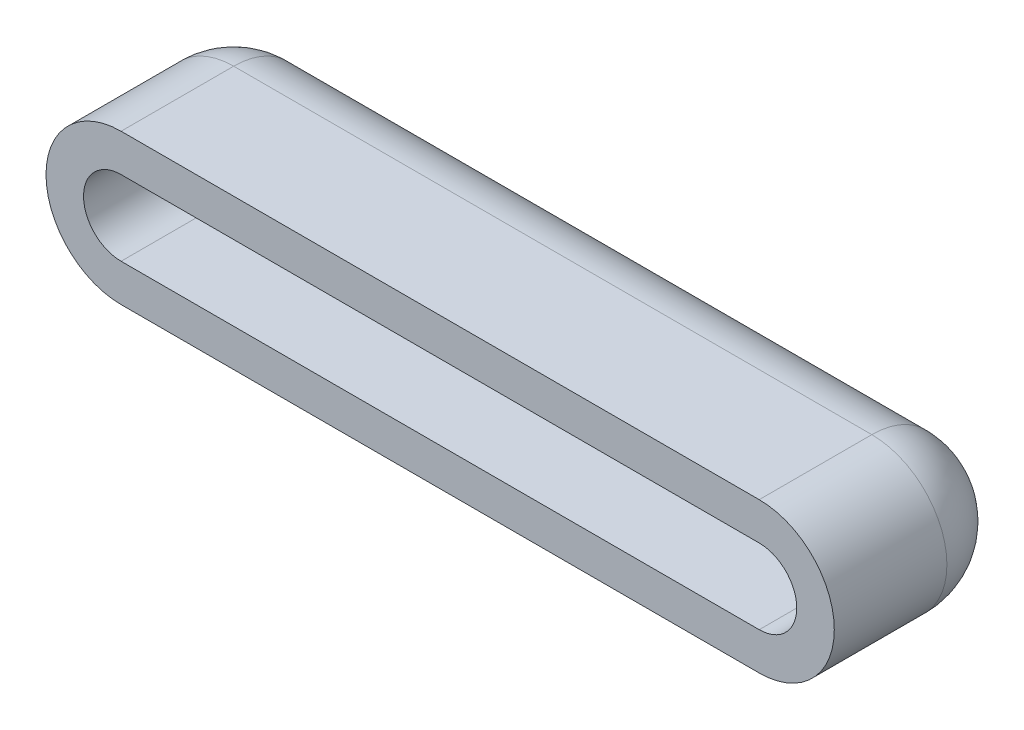
ISO-10303-21;
HEADER;
FILE_DESCRIPTION(('STEP AP214'),'2;1');
FILE_NAME('part.step','',(''),(''),'','','');
FILE_SCHEMA(('AUTOMOTIVE_DESIGN { 1 0 10303 214 1 1 1 1 }'));
ENDSEC;
DATA;
#1=APPLICATION_CONTEXT('core data for automotive mechanical design processes');
#2=APPLICATION_PROTOCOL_DEFINITION('international standard','automotive_design',2000,#1);
#3=PRODUCT_CONTEXT('',#1,'mechanical');
#4=PRODUCT('Part','Part','',(#3));
#5=PRODUCT_RELATED_PRODUCT_CATEGORY('part','',(#4));
#6=PRODUCT_DEFINITION_FORMATION('','',#4);
#7=PRODUCT_DEFINITION_CONTEXT('part definition',#1,'design');
#8=PRODUCT_DEFINITION('design','',#6,#7);
#9=PRODUCT_DEFINITION_SHAPE('','',#8);
#10=(LENGTH_UNIT() NAMED_UNIT(*) SI_UNIT(.MILLI.,.METRE.));
#11=(NAMED_UNIT(*) PLANE_ANGLE_UNIT() SI_UNIT($,.RADIAN.));
#12=(NAMED_UNIT(*) SI_UNIT($,.STERADIAN.) SOLID_ANGLE_UNIT());
#13=UNCERTAINTY_MEASURE_WITH_UNIT(LENGTH_MEASURE(1.E-05),#10,'distance_accuracy_value','');
#14=(GEOMETRIC_REPRESENTATION_CONTEXT(3) GLOBAL_UNCERTAINTY_ASSIGNED_CONTEXT((#13)) GLOBAL_UNIT_ASSIGNED_CONTEXT((#10,
#11,#12)) REPRESENTATION_CONTEXT('',''));
#15=CARTESIAN_POINT('',(0.,0.,0.));
#16=DIRECTION('',(0.,0.,1.));
#17=DIRECTION('',(1.,0.,0.));
#18=AXIS2_PLACEMENT_3D('',#15,#16,#17);
#19=CARTESIAN_POINT('',(0.,0.,10.));
#20=DIRECTION('',(0.,0.,-1.));
#21=DIRECTION('',(-1.,0.,0.));
#22=AXIS2_PLACEMENT_3D('',#19,#20,#21);
#23=CYLINDRICAL_SURFACE('',#22,4.);
#24=DIRECTION('',(0.,0.,-1.));
#25=VECTOR('',#24,1.);
#26=CARTESIAN_POINT('',(0.,4.,10.));
#27=LINE('',#26,#25);
#28=CARTESIAN_POINT('',(0.,4.,10.));
#29=VERTEX_POINT('',#28);
#30=CARTESIAN_POINT('',(0.,4.,4.));
#31=VERTEX_POINT('',#30);
#32=EDGE_CURVE('E104',#29,#31,#27,.T.);
#33=ORIENTED_EDGE('',*,*,#32,.T.);
#34=CARTESIAN_POINT('',(0.,0.,4.));
#35=DIRECTION('',(0.,0.,-1.));
#36=DIRECTION('',(-1.,0.,0.));
#37=AXIS2_PLACEMENT_3D('',#34,#35,#36);
#38=CIRCLE('',#37,4.);
#39=CARTESIAN_POINT('',(0.,-4.,4.));
#40=VERTEX_POINT('',#39);
#41=EDGE_CURVE('E11',#31,#40,#38,.F.);
#42=ORIENTED_EDGE('',*,*,#41,.T.);
#43=DIRECTION('',(0.,0.,-1.));
#44=VECTOR('',#43,1.);
#45=CARTESIAN_POINT('',(0.,-4.,10.));
#46=LINE('',#45,#44);
#47=CARTESIAN_POINT('',(0.,-4.,10.));
#48=VERTEX_POINT('',#47);
#49=EDGE_CURVE('E96',#48,#40,#46,.T.);
#50=ORIENTED_EDGE('',*,*,#49,.F.);
#51=CARTESIAN_POINT('',(0.,0.,10.));
#52=DIRECTION('',(0.,0.,1.));
#53=DIRECTION('',(1.,0.,0.));
#54=AXIS2_PLACEMENT_3D('',#51,#52,#53);
#55=CIRCLE('',#54,4.);
#56=EDGE_CURVE('E115',#29,#48,#55,.T.);
#57=ORIENTED_EDGE('',*,*,#56,.F.);
#58=EDGE_LOOP('',(#33,#42,#50,#57));
#59=FACE_BOUND('',#58,.T.);
#60=ADVANCED_FACE('F33',(#59),#23,.T.);
#61=CARTESIAN_POINT('',(0.,-4.,10.));
#62=DIRECTION('',(0.,1.,0.));
#63=DIRECTION('',(0.,0.,1.));
#64=AXIS2_PLACEMENT_3D('',#61,#62,#63);
#65=PLANE('',#64);
#66=ORIENTED_EDGE('',*,*,#49,.T.);
#67=DIRECTION('',(1.,0.,0.));
#68=VECTOR('',#67,1.);
#69=CARTESIAN_POINT('',(0.,-4.,4.));
#70=LINE('',#69,#68);
#71=CARTESIAN_POINT('',(34.,-4.,4.));
#72=VERTEX_POINT('',#71);
#73=EDGE_CURVE('E43',#40,#72,#70,.T.);
#74=ORIENTED_EDGE('',*,*,#73,.T.);
#75=DIRECTION('',(0.,0.,-1.));
#76=VECTOR('',#75,1.);
#77=CARTESIAN_POINT('',(34.,-4.,10.));
#78=LINE('',#77,#76);
#79=CARTESIAN_POINT('',(34.,-4.,10.));
#80=VERTEX_POINT('',#79);
#81=EDGE_CURVE('E98',#80,#72,#78,.T.);
#82=ORIENTED_EDGE('',*,*,#81,.F.);
#83=DIRECTION('',(1.,0.,0.));
#84=VECTOR('',#83,1.);
#85=CARTESIAN_POINT('',(0.,-4.,10.));
#86=LINE('',#85,#84);
#87=EDGE_CURVE('E112',#48,#80,#86,.T.);
#88=ORIENTED_EDGE('',*,*,#87,.F.);
#89=EDGE_LOOP('',(#66,#74,#82,#88));
#90=FACE_BOUND('',#89,.T.);
#91=ADVANCED_FACE('F202',(#90),#65,.F.);
#92=CARTESIAN_POINT('',(34.,0.,10.));
#93=DIRECTION('',(0.,0.,-1.));
#94=DIRECTION('',(-1.,0.,0.));
#95=AXIS2_PLACEMENT_3D('',#92,#93,#94);
#96=CYLINDRICAL_SURFACE('',#95,4.);
#97=ORIENTED_EDGE('',*,*,#81,.T.);
#98=CARTESIAN_POINT('',(34.,0.,4.));
#99=DIRECTION('',(0.,0.,-1.));
#100=DIRECTION('',(-1.,0.,0.));
#101=AXIS2_PLACEMENT_3D('',#98,#99,#100);
#102=CIRCLE('',#101,4.);
#103=CARTESIAN_POINT('',(34.,4.,4.));
#104=VERTEX_POINT('',#103);
#105=EDGE_CURVE('E91',#72,#104,#102,.F.);
#106=ORIENTED_EDGE('',*,*,#105,.T.);
#107=DIRECTION('',(0.,0.,-1.));
#108=VECTOR('',#107,1.);
#109=CARTESIAN_POINT('',(34.,4.,10.));
#110=LINE('',#109,#108);
#111=CARTESIAN_POINT('',(34.,4.,10.));
#112=VERTEX_POINT('',#111);
#113=EDGE_CURVE('E101',#112,#104,#110,.T.);
#114=ORIENTED_EDGE('',*,*,#113,.F.);
#115=CARTESIAN_POINT('',(34.,0.,10.));
#116=DIRECTION('',(0.,0.,1.));
#117=DIRECTION('',(1.,0.,0.));
#118=AXIS2_PLACEMENT_3D('',#115,#116,#117);
#119=CIRCLE('',#118,4.);
#120=EDGE_CURVE('E109',#80,#112,#119,.T.);
#121=ORIENTED_EDGE('',*,*,#120,.F.);
#122=EDGE_LOOP('',(#97,#106,#114,#121));
#123=FACE_BOUND('',#122,.T.);
#124=ADVANCED_FACE('F187',(#123),#96,.T.);
#125=CARTESIAN_POINT('',(0.,4.,10.));
#126=DIRECTION('',(0.,-1.,0.));
#127=DIRECTION('',(0.,0.,-1.));
#128=AXIS2_PLACEMENT_3D('',#125,#126,#127);
#129=PLANE('',#128);
#130=ORIENTED_EDGE('',*,*,#113,.T.);
#131=DIRECTION('',(-1.,0.,0.));
#132=VECTOR('',#131,1.);
#133=CARTESIAN_POINT('',(0.,4.,4.));
#134=LINE('',#133,#132);
#135=EDGE_CURVE('E94',#104,#31,#134,.T.);
#136=ORIENTED_EDGE('',*,*,#135,.T.);
#137=ORIENTED_EDGE('',*,*,#32,.F.);
#138=DIRECTION('',(-1.,0.,0.));
#139=VECTOR('',#138,1.);
#140=CARTESIAN_POINT('',(0.,4.,10.));
#141=LINE('',#140,#139);
#142=EDGE_CURVE('E106',#112,#29,#141,.T.);
#143=ORIENTED_EDGE('',*,*,#142,.F.);
#144=EDGE_LOOP('',(#130,#136,#137,#143));
#145=FACE_BOUND('',#144,.T.);
#146=ADVANCED_FACE('F192',(#145),#129,.F.);
#147=CARTESIAN_POINT('',(0.,0.,10.));
#148=DIRECTION('',(0.,0.,1.));
#149=DIRECTION('',(1.,0.,0.));
#150=AXIS2_PLACEMENT_3D('',#147,#148,#149);
#151=PLANE('',#150);
#152=CARTESIAN_POINT('',(0.,0.,10.));
#153=DIRECTION('',(0.,0.,1.));
#154=DIRECTION('',(1.,0.,0.));
#155=AXIS2_PLACEMENT_3D('',#152,#153,#154);
#156=CIRCLE('',#155,2.);
#157=CARTESIAN_POINT('',(0.,2.,10.));
#158=VERTEX_POINT('',#157);
#159=CARTESIAN_POINT('',(0.,-2.,10.));
#160=VERTEX_POINT('',#159);
#161=EDGE_CURVE('E129',#158,#160,#156,.T.);
#162=ORIENTED_EDGE('',*,*,#161,.F.);
#163=DIRECTION('',(-1.,0.,0.));
#164=VECTOR('',#163,1.);
#165=CARTESIAN_POINT('',(0.,2.,10.));
#166=LINE('',#165,#164);
#167=CARTESIAN_POINT('',(34.,2.,10.));
#168=VERTEX_POINT('',#167);
#169=EDGE_CURVE('E119',#168,#158,#166,.T.);
#170=ORIENTED_EDGE('',*,*,#169,.F.);
#171=CARTESIAN_POINT('',(34.,0.,10.));
#172=DIRECTION('',(0.,0.,1.));
#173=DIRECTION('',(1.,0.,0.));
#174=AXIS2_PLACEMENT_3D('',#171,#172,#173);
#175=CIRCLE('',#174,2.);
#176=CARTESIAN_POINT('',(34.,-2.,10.));
#177=VERTEX_POINT('',#176);
#178=EDGE_CURVE('E123',#177,#168,#175,.T.);
#179=ORIENTED_EDGE('',*,*,#178,.F.);
#180=DIRECTION('',(1.,0.,0.));
#181=VECTOR('',#180,1.);
#182=CARTESIAN_POINT('',(0.,-2.,10.));
#183=LINE('',#182,#181);
#184=EDGE_CURVE('E126',#160,#177,#183,.T.);
#185=ORIENTED_EDGE('',*,*,#184,.F.);
#186=EDGE_LOOP('',(#162,#170,#179,#185));
#187=FACE_BOUND('',#186,.T.);
#188=ORIENTED_EDGE('',*,*,#56,.T.);
#189=ORIENTED_EDGE('',*,*,#87,.T.);
#190=ORIENTED_EDGE('',*,*,#120,.T.);
#191=ORIENTED_EDGE('',*,*,#142,.T.);
#192=EDGE_LOOP('',(#188,#189,#190,#191));
#193=FACE_BOUND('',#192,.T.);
#194=ADVANCED_FACE('F239',(#187,#193),#151,.T.);
#195=CARTESIAN_POINT('',(0.,0.,10.));
#196=DIRECTION('',(0.,0.,-1.));
#197=DIRECTION('',(-1.,0.,0.));
#198=AXIS2_PLACEMENT_3D('',#195,#196,#197);
#199=CYLINDRICAL_SURFACE('',#198,2.);
#200=CARTESIAN_POINT('',(0.,0.,2.));
#201=DIRECTION('',(0.,0.,1.));
#202=DIRECTION('',(1.,0.,0.));
#203=AXIS2_PLACEMENT_3D('',#200,#201,#202);
#204=CIRCLE('',#203,2.);
#205=CARTESIAN_POINT('',(0.,2.,2.));
#206=VERTEX_POINT('',#205);
#207=CARTESIAN_POINT('',(0.,-2.,2.));
#208=VERTEX_POINT('',#207);
#209=EDGE_CURVE('E147',#206,#208,#204,.T.);
#210=ORIENTED_EDGE('',*,*,#209,.F.);
#211=DIRECTION('',(0.,0.,-1.));
#212=VECTOR('',#211,1.);
#213=CARTESIAN_POINT('',(0.,2.,10.));
#214=LINE('',#213,#212);
#215=EDGE_CURVE('E122',#158,#206,#214,.T.);
#216=ORIENTED_EDGE('',*,*,#215,.F.);
#217=ORIENTED_EDGE('',*,*,#161,.T.);
#218=DIRECTION('',(0.,0.,1.));
#219=VECTOR('',#218,1.);
#220=CARTESIAN_POINT('',(0.,-2.,10.));
#221=LINE('',#220,#219);
#222=EDGE_CURVE('E118',#160,#208,#221,.F.);
#223=ORIENTED_EDGE('',*,*,#222,.T.);
#224=EDGE_LOOP('',(#210,#216,#217,#223));
#225=FACE_BOUND('',#224,.T.);
#226=ADVANCED_FACE('F160',(#225),#199,.F.);
#227=CARTESIAN_POINT('',(0.,-2.,10.));
#228=DIRECTION('',(0.,1.,0.));
#229=DIRECTION('',(0.,0.,1.));
#230=AXIS2_PLACEMENT_3D('',#227,#228,#229);
#231=PLANE('',#230);
#232=DIRECTION('',(1.,0.,0.));
#233=VECTOR('',#232,1.);
#234=CARTESIAN_POINT('',(0.,-2.,2.));
#235=LINE('',#234,#233);
#236=CARTESIAN_POINT('',(34.,-2.,2.));
#237=VERTEX_POINT('',#236);
#238=EDGE_CURVE('E142',#208,#237,#235,.T.);
#239=ORIENTED_EDGE('',*,*,#238,.F.);
#240=ORIENTED_EDGE('',*,*,#222,.F.);
#241=ORIENTED_EDGE('',*,*,#184,.T.);
#242=DIRECTION('',(0.,0.,-1.));
#243=VECTOR('',#242,1.);
#244=CARTESIAN_POINT('',(34.,-2.,10.));
#245=LINE('',#244,#243);
#246=EDGE_CURVE('E139',#177,#237,#245,.T.);
#247=ORIENTED_EDGE('',*,*,#246,.T.);
#248=EDGE_LOOP('',(#239,#240,#241,#247));
#249=FACE_BOUND('',#248,.T.);
#250=ADVANCED_FACE('F284',(#249),#231,.T.);
#251=CARTESIAN_POINT('',(34.,0.,10.));
#252=DIRECTION('',(0.,0.,-1.));
#253=DIRECTION('',(-1.,0.,0.));
#254=AXIS2_PLACEMENT_3D('',#251,#252,#253);
#255=CYLINDRICAL_SURFACE('',#254,2.);
#256=CARTESIAN_POINT('',(34.,0.,2.));
#257=DIRECTION('',(0.,0.,1.));
#258=DIRECTION('',(1.,0.,0.));
#259=AXIS2_PLACEMENT_3D('',#256,#257,#258);
#260=CIRCLE('',#259,2.);
#261=CARTESIAN_POINT('',(34.,2.,2.));
#262=VERTEX_POINT('',#261);
#263=EDGE_CURVE('E135',#237,#262,#260,.T.);
#264=ORIENTED_EDGE('',*,*,#263,.F.);
#265=ORIENTED_EDGE('',*,*,#246,.F.);
#266=ORIENTED_EDGE('',*,*,#178,.T.);
#267=DIRECTION('',(0.,0.,-1.));
#268=VECTOR('',#267,1.);
#269=CARTESIAN_POINT('',(34.,2.,10.));
#270=LINE('',#269,#268);
#271=EDGE_CURVE('E136',#168,#262,#270,.T.);
#272=ORIENTED_EDGE('',*,*,#271,.T.);
#273=EDGE_LOOP('',(#264,#265,#266,#272));
#274=FACE_BOUND('',#273,.T.);
#275=ADVANCED_FACE('F274',(#274),#255,.F.);
#276=CARTESIAN_POINT('',(0.,2.,10.));
#277=DIRECTION('',(0.,-1.,0.));
#278=DIRECTION('',(0.,0.,-1.));
#279=AXIS2_PLACEMENT_3D('',#276,#277,#278);
#280=PLANE('',#279);
#281=DIRECTION('',(-1.,0.,0.));
#282=VECTOR('',#281,1.);
#283=CARTESIAN_POINT('',(0.,2.,2.));
#284=LINE('',#283,#282);
#285=EDGE_CURVE('E132',#262,#206,#284,.T.);
#286=ORIENTED_EDGE('',*,*,#285,.F.);
#287=ORIENTED_EDGE('',*,*,#271,.F.);
#288=ORIENTED_EDGE('',*,*,#169,.T.);
#289=ORIENTED_EDGE('',*,*,#215,.T.);
#290=EDGE_LOOP('',(#286,#287,#288,#289));
#291=FACE_BOUND('',#290,.T.);
#292=ADVANCED_FACE('F265',(#291),#280,.T.);
#293=CARTESIAN_POINT('',(0.,0.,2.));
#294=DIRECTION('',(0.,0.,1.));
#295=DIRECTION('',(1.,0.,0.));
#296=AXIS2_PLACEMENT_3D('',#293,#294,#295);
#297=PLANE('',#296);
#298=ORIENTED_EDGE('',*,*,#209,.T.);
#299=ORIENTED_EDGE('',*,*,#238,.T.);
#300=ORIENTED_EDGE('',*,*,#263,.T.);
#301=ORIENTED_EDGE('',*,*,#285,.T.);
#302=EDGE_LOOP('',(#298,#299,#300,#301));
#303=FACE_BOUND('',#302,.T.);
#304=ADVANCED_FACE('F155',(#303),#297,.T.);
#305=CARTESIAN_POINT('',(0.,0.,4.));
#306=DIRECTION('',(1.,0.,0.));
#307=DIRECTION('',(0.,0.,-1.));
#308=AXIS2_PLACEMENT_3D('',#305,#306,#307);
#309=CYLINDRICAL_SURFACE('',#308,4.);
#310=CARTESIAN_POINT('',(34.,0.,4.));
#311=DIRECTION('',(1.,0.,0.));
#312=DIRECTION('',(0.,0.,-1.));
#313=AXIS2_PLACEMENT_3D('',#310,#311,#312);
#314=CIRCLE('',#313,4.);
#315=CARTESIAN_POINT('',(34.,0.,0.));
#316=VERTEX_POINT('',#315);
#317=EDGE_CURVE('E37',#72,#316,#314,.T.);
#318=ORIENTED_EDGE('',*,*,#317,.F.);
#319=ORIENTED_EDGE('',*,*,#73,.F.);
#320=CARTESIAN_POINT('',(0.,0.,4.));
#321=DIRECTION('',(-1.,0.,0.));
#322=DIRECTION('',(0.,0.,1.));
#323=AXIS2_PLACEMENT_3D('',#320,#321,#322);
#324=CIRCLE('',#323,4.);
#325=CARTESIAN_POINT('',(0.,0.,0.));
#326=VERTEX_POINT('',#325);
#327=EDGE_CURVE('E71',#326,#40,#324,.T.);
#328=ORIENTED_EDGE('',*,*,#327,.F.);
#329=DIRECTION('',(1.,0.,0.));
#330=VECTOR('',#329,1.);
#331=CARTESIAN_POINT('',(0.,0.,0.));
#332=LINE('',#331,#330);
#333=EDGE_CURVE('E73',#316,#326,#332,.F.);
#334=ORIENTED_EDGE('',*,*,#333,.F.);
#335=EDGE_LOOP('',(#318,#319,#328,#334));
#336=FACE_BOUND('',#335,.T.);
#337=ADVANCED_FACE('F35',(#336),#309,.T.);
#338=CARTESIAN_POINT('',(34.,0.,4.));
#339=DIRECTION('',(0.,0.,1.));
#340=DIRECTION('',(1.,0.,0.));
#341=AXIS2_PLACEMENT_3D('',#338,#339,#340);
#342=SPHERICAL_SURFACE('',#341,4.);
#343=ORIENTED_EDGE('',*,*,#105,.F.);
#344=ORIENTED_EDGE('',*,*,#317,.T.);
#345=CARTESIAN_POINT('',(34.,0.,4.));
#346=DIRECTION('',(-1.,0.,0.));
#347=DIRECTION('',(0.,0.,1.));
#348=AXIS2_PLACEMENT_3D('',#345,#346,#347);
#349=CIRCLE('',#348,4.);
#350=EDGE_CURVE('E83',#104,#316,#349,.T.);
#351=ORIENTED_EDGE('',*,*,#350,.F.);
#352=EDGE_LOOP('',(#343,#344,#351));
#353=FACE_BOUND('',#352,.T.);
#354=ADVANCED_FACE('F194',(#353),#342,.T.);
#355=CARTESIAN_POINT('',(0.,0.,4.));
#356=DIRECTION('',(0.,0.,1.));
#357=DIRECTION('',(1.,0.,0.));
#358=AXIS2_PLACEMENT_3D('',#355,#356,#357);
#359=SPHERICAL_SURFACE('',#358,4.);
#360=ORIENTED_EDGE('',*,*,#327,.T.);
#361=ORIENTED_EDGE('',*,*,#41,.F.);
#362=CARTESIAN_POINT('',(0.,0.,4.));
#363=DIRECTION('',(1.,0.,0.));
#364=DIRECTION('',(0.,0.,-1.));
#365=AXIS2_PLACEMENT_3D('',#362,#363,#364);
#366=CIRCLE('',#365,4.);
#367=EDGE_CURVE('E82',#326,#31,#366,.T.);
#368=ORIENTED_EDGE('',*,*,#367,.F.);
#369=EDGE_LOOP('',(#360,#361,#368));
#370=FACE_BOUND('',#369,.T.);
#371=ADVANCED_FACE('F85',(#370),#359,.T.);
#372=CARTESIAN_POINT('',(0.,0.,4.));
#373=DIRECTION('',(-1.,0.,0.));
#374=DIRECTION('',(0.,0.,1.));
#375=AXIS2_PLACEMENT_3D('',#372,#373,#374);
#376=CYLINDRICAL_SURFACE('',#375,4.);
#377=ORIENTED_EDGE('',*,*,#350,.T.);
#378=ORIENTED_EDGE('',*,*,#333,.T.);
#379=ORIENTED_EDGE('',*,*,#367,.T.);
#380=ORIENTED_EDGE('',*,*,#135,.F.);
#381=EDGE_LOOP('',(#377,#378,#379,#380));
#382=FACE_BOUND('',#381,.T.);
#383=ADVANCED_FACE('F79',(#382),#376,.T.);
#384=CLOSED_SHELL('',(#60,#91,#124,#146,#194,#226,#250,#275,#292,#304,#337,#354,#371,#383));
#385=MANIFOLD_SOLID_BREP('B2',#384);
#386=ADVANCED_BREP_SHAPE_REPRESENTATION('',(#18,#385),#14);
#387=SHAPE_DEFINITION_REPRESENTATION(#9,#386);
ENDSEC;
END-ISO-10303-21;
